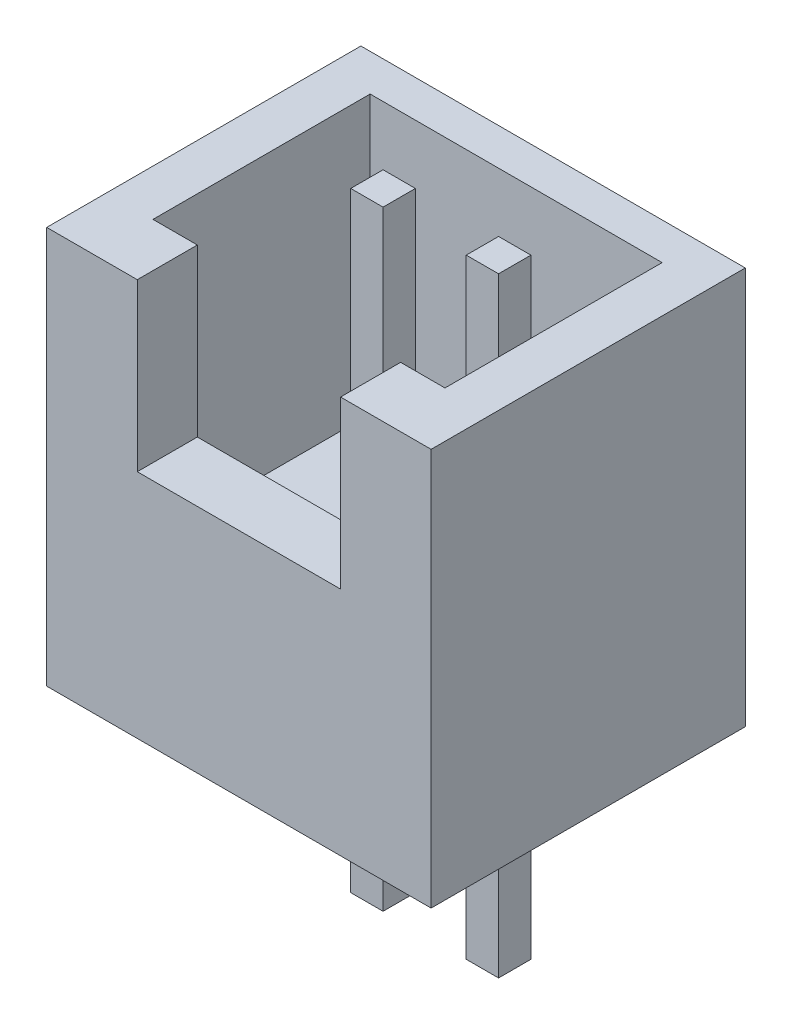
ISO-10303-21;
HEADER;
FILE_DESCRIPTION(('STEP AP214'),'2;1');
FILE_NAME('part.step','',(''),(''),'','','');
FILE_SCHEMA(('AUTOMOTIVE_DESIGN { 1 0 10303 214 1 1 1 1 }'));
ENDSEC;
DATA;
#1=APPLICATION_CONTEXT('core data for automotive mechanical design processes');
#2=APPLICATION_PROTOCOL_DEFINITION('international standard','automotive_design',2000,#1);
#3=PRODUCT_CONTEXT('',#1,'mechanical');
#4=PRODUCT('Part','Part','',(#3));
#5=PRODUCT_RELATED_PRODUCT_CATEGORY('part','',(#4));
#6=PRODUCT_DEFINITION_FORMATION('','',#4);
#7=PRODUCT_DEFINITION_CONTEXT('part definition',#1,'design');
#8=PRODUCT_DEFINITION('design','',#6,#7);
#9=PRODUCT_DEFINITION_SHAPE('','',#8);
#10=(LENGTH_UNIT() NAMED_UNIT(*) SI_UNIT(.MILLI.,.METRE.));
#11=(NAMED_UNIT(*) PLANE_ANGLE_UNIT() SI_UNIT($,.RADIAN.));
#12=(NAMED_UNIT(*) SI_UNIT($,.STERADIAN.) SOLID_ANGLE_UNIT());
#13=UNCERTAINTY_MEASURE_WITH_UNIT(LENGTH_MEASURE(1.E-05),#10,'distance_accuracy_value','');
#14=(GEOMETRIC_REPRESENTATION_CONTEXT(3) GLOBAL_UNCERTAINTY_ASSIGNED_CONTEXT((#13)) GLOBAL_UNIT_ASSIGNED_CONTEXT((#10,
#11,#12)) REPRESENTATION_CONTEXT('',''));
#15=CARTESIAN_POINT('',(0.,0.,0.));
#16=DIRECTION('',(0.,0.,1.));
#17=DIRECTION('',(1.,0.,0.));
#18=AXIS2_PLACEMENT_3D('',#15,#16,#17);
#19=CARTESIAN_POINT('',(-0.175000000000002,-2.3,-0.174999999999998));
#20=DIRECTION('',(0.,0.,-1.));
#21=DIRECTION('',(-1.,0.,0.));
#22=AXIS2_PLACEMENT_3D('',#19,#20,#21);
#23=PLANE('',#22);
#24=DIRECTION('',(0.,1.,0.));
#25=VECTOR('',#24,1.);
#26=CARTESIAN_POINT('',(-0.175000000000002,-2.3,-0.174999999999998));
#27=LINE('',#26,#25);
#28=CARTESIAN_POINT('',(-0.175000000000002,4.3,-0.174999999999998));
#29=VERTEX_POINT('',#28);
#30=CARTESIAN_POINT('',(-0.175000000000002,1.3,-0.174999999999998));
#31=VERTEX_POINT('',#30);
#32=EDGE_CURVE('E204',#29,#31,#27,.F.);
#33=ORIENTED_EDGE('',*,*,#32,.F.);
#34=DIRECTION('',(-1.,0.,0.));
#35=VECTOR('',#34,1.);
#36=CARTESIAN_POINT('',(-0.175000000000002,4.3,-0.174999999999998));
#37=LINE('',#36,#35);
#38=CARTESIAN_POINT('',(0.175000000000002,4.3,-0.174999999999998));
#39=VERTEX_POINT('',#38);
#40=EDGE_CURVE('E209',#29,#39,#37,.F.);
#41=ORIENTED_EDGE('',*,*,#40,.T.);
#42=DIRECTION('',(0.,1.,0.));
#43=VECTOR('',#42,1.);
#44=CARTESIAN_POINT('',(0.175000000000002,-2.3,-0.174999999999998));
#45=LINE('',#44,#43);
#46=CARTESIAN_POINT('',(0.175000000000002,1.3,-0.174999999999998));
#47=VERTEX_POINT('',#46);
#48=EDGE_CURVE('E206',#47,#39,#45,.T.);
#49=ORIENTED_EDGE('',*,*,#48,.F.);
#50=DIRECTION('',(-1.,0.,0.));
#51=VECTOR('',#50,1.);
#52=CARTESIAN_POINT('',(-0.175000000000002,1.3,-0.174999999999998));
#53=LINE('',#52,#51);
#54=EDGE_CURVE('E19',#47,#31,#53,.T.);
#55=ORIENTED_EDGE('',*,*,#54,.T.);
#56=EDGE_LOOP('',(#33,#41,#49,#55));
#57=FACE_BOUND('',#56,.T.);
#58=ADVANCED_FACE('F16',(#57),#23,.T.);
#59=CARTESIAN_POINT('',(-1.425,-2.3,-0.174999999999998));
#60=DIRECTION('',(0.,0.,-1.));
#61=DIRECTION('',(-1.,0.,0.));
#62=AXIS2_PLACEMENT_3D('',#59,#60,#61);
#63=PLANE('',#62);
#64=DIRECTION('',(0.,1.,0.));
#65=VECTOR('',#64,1.);
#66=CARTESIAN_POINT('',(-1.425,-2.3,-0.174999999999998));
#67=LINE('',#66,#65);
#68=CARTESIAN_POINT('',(-1.425,4.3,-0.174999999999998));
#69=VERTEX_POINT('',#68);
#70=CARTESIAN_POINT('',(-1.425,1.3,-0.174999999999998));
#71=VERTEX_POINT('',#70);
#72=EDGE_CURVE('E237',#69,#71,#67,.F.);
#73=ORIENTED_EDGE('',*,*,#72,.F.);
#74=DIRECTION('',(-1.,0.,0.));
#75=VECTOR('',#74,1.);
#76=CARTESIAN_POINT('',(-1.425,4.3,-0.174999999999998));
#77=LINE('',#76,#75);
#78=CARTESIAN_POINT('',(-1.075,4.3,-0.174999999999998));
#79=VERTEX_POINT('',#78);
#80=EDGE_CURVE('E216',#69,#79,#77,.F.);
#81=ORIENTED_EDGE('',*,*,#80,.T.);
#82=DIRECTION('',(0.,1.,0.));
#83=VECTOR('',#82,1.);
#84=CARTESIAN_POINT('',(-1.075,-2.3,-0.174999999999998));
#85=LINE('',#84,#83);
#86=CARTESIAN_POINT('',(-1.075,1.3,-0.174999999999998));
#87=VERTEX_POINT('',#86);
#88=EDGE_CURVE('E247',#87,#79,#85,.T.);
#89=ORIENTED_EDGE('',*,*,#88,.F.);
#90=DIRECTION('',(-1.,0.,0.));
#91=VECTOR('',#90,1.);
#92=CARTESIAN_POINT('',(-1.425,1.3,-0.174999999999998));
#93=LINE('',#92,#91);
#94=EDGE_CURVE('E227',#87,#71,#93,.T.);
#95=ORIENTED_EDGE('',*,*,#94,.T.);
#96=EDGE_LOOP('',(#73,#81,#89,#95));
#97=FACE_BOUND('',#96,.T.);
#98=ADVANCED_FACE('F803',(#97),#63,.T.);
#99=CARTESIAN_POINT('',(-0.175000000000002,-2.3,-0.174999999999998));
#100=DIRECTION('',(-1.,0.,0.));
#101=DIRECTION('',(0.,0.,1.));
#102=AXIS2_PLACEMENT_3D('',#99,#100,#101);
#103=PLANE('',#102);
#104=DIRECTION('',(0.,1.,0.));
#105=VECTOR('',#104,1.);
#106=CARTESIAN_POINT('',(-0.175000000000002,-2.3,0.175000000000002));
#107=LINE('',#106,#105);
#108=CARTESIAN_POINT('',(-0.175000000000002,4.3,0.175000000000002));
#109=VERTEX_POINT('',#108);
#110=CARTESIAN_POINT('',(-0.175000000000002,1.3,0.175000000000002));
#111=VERTEX_POINT('',#110);
#112=EDGE_CURVE('E255',#109,#111,#107,.F.);
#113=ORIENTED_EDGE('',*,*,#112,.F.);
#114=DIRECTION('',(0.,0.,1.));
#115=VECTOR('',#114,1.);
#116=CARTESIAN_POINT('',(-0.175000000000002,4.3,2.185));
#117=LINE('',#116,#115);
#118=EDGE_CURVE('E215',#29,#109,#117,.T.);
#119=ORIENTED_EDGE('',*,*,#118,.F.);
#120=ORIENTED_EDGE('',*,*,#32,.T.);
#121=DIRECTION('',(0.,0.,1.));
#122=VECTOR('',#121,1.);
#123=CARTESIAN_POINT('',(-0.175000000000002,1.3,-0.174999999999998));
#124=LINE('',#123,#122);
#125=EDGE_CURVE('E213',#31,#111,#124,.T.);
#126=ORIENTED_EDGE('',*,*,#125,.T.);
#127=EDGE_LOOP('',(#113,#119,#120,#126));
#128=FACE_BOUND('',#127,.T.);
#129=ADVANCED_FACE('F212',(#128),#103,.T.);
#130=CARTESIAN_POINT('',(0.175000000000002,-2.3,-0.174999999999998));
#131=DIRECTION('',(1.,0.,0.));
#132=DIRECTION('',(0.,0.,-1.));
#133=AXIS2_PLACEMENT_3D('',#130,#131,#132);
#134=PLANE('',#133);
#135=ORIENTED_EDGE('',*,*,#48,.T.);
#136=DIRECTION('',(0.,0.,1.));
#137=VECTOR('',#136,1.);
#138=CARTESIAN_POINT('',(0.175000000000002,4.3,2.185));
#139=LINE('',#138,#137);
#140=CARTESIAN_POINT('',(0.175000000000002,4.3,0.175000000000002));
#141=VERTEX_POINT('',#140);
#142=EDGE_CURVE('E232',#141,#39,#139,.F.);
#143=ORIENTED_EDGE('',*,*,#142,.F.);
#144=DIRECTION('',(0.,1.,0.));
#145=VECTOR('',#144,1.);
#146=CARTESIAN_POINT('',(0.175000000000002,-2.3,0.175000000000002));
#147=LINE('',#146,#145);
#148=CARTESIAN_POINT('',(0.175000000000002,1.3,0.175000000000002));
#149=VERTEX_POINT('',#148);
#150=EDGE_CURVE('E257',#149,#141,#147,.T.);
#151=ORIENTED_EDGE('',*,*,#150,.F.);
#152=DIRECTION('',(0.,0.,-1.));
#153=VECTOR('',#152,1.);
#154=CARTESIAN_POINT('',(0.175000000000002,1.3,-0.174999999999998));
#155=LINE('',#154,#153);
#156=EDGE_CURVE('E197',#149,#47,#155,.T.);
#157=ORIENTED_EDGE('',*,*,#156,.T.);
#158=EDGE_LOOP('',(#135,#143,#151,#157));
#159=FACE_BOUND('',#158,.T.);
#160=ADVANCED_FACE('F231',(#159),#134,.T.);
#161=CARTESIAN_POINT('',(-2.70500000000001,4.3,2.185));
#162=DIRECTION('',(0.,1.,0.));
#163=DIRECTION('',(0.,0.,1.));
#164=AXIS2_PLACEMENT_3D('',#161,#162,#163);
#165=PLANE('',#164);
#166=DIRECTION('',(1.,0.,0.));
#167=VECTOR('',#166,1.);
#168=CARTESIAN_POINT('',(-0.175000000000002,4.3,0.175000000000002));
#169=LINE('',#168,#167);
#170=EDGE_CURVE('E236',#141,#109,#169,.F.);
#171=ORIENTED_EDGE('',*,*,#170,.F.);
#172=ORIENTED_EDGE('',*,*,#142,.T.);
#173=ORIENTED_EDGE('',*,*,#40,.F.);
#174=ORIENTED_EDGE('',*,*,#118,.T.);
#175=EDGE_LOOP('',(#171,#172,#173,#174));
#176=FACE_BOUND('',#175,.T.);
#177=ADVANCED_FACE('F234',(#176),#165,.T.);
#178=CARTESIAN_POINT('',(-1.425,-2.3,-0.174999999999998));
#179=DIRECTION('',(-1.,0.,0.));
#180=DIRECTION('',(0.,0.,1.));
#181=AXIS2_PLACEMENT_3D('',#178,#179,#180);
#182=PLANE('',#181);
#183=DIRECTION('',(0.,1.,0.));
#184=VECTOR('',#183,1.);
#185=CARTESIAN_POINT('',(-1.425,-2.3,0.175000000000002));
#186=LINE('',#185,#184);
#187=CARTESIAN_POINT('',(-1.425,4.3,0.175000000000002));
#188=VERTEX_POINT('',#187);
#189=CARTESIAN_POINT('',(-1.425,1.3,0.175000000000002));
#190=VERTEX_POINT('',#189);
#191=EDGE_CURVE('E260',#188,#190,#186,.F.);
#192=ORIENTED_EDGE('',*,*,#191,.F.);
#193=DIRECTION('',(0.,0.,1.));
#194=VECTOR('',#193,1.);
#195=CARTESIAN_POINT('',(-1.425,4.3,2.185));
#196=LINE('',#195,#194);
#197=EDGE_CURVE('E250',#69,#188,#196,.T.);
#198=ORIENTED_EDGE('',*,*,#197,.F.);
#199=ORIENTED_EDGE('',*,*,#72,.T.);
#200=DIRECTION('',(0.,0.,1.));
#201=VECTOR('',#200,1.);
#202=CARTESIAN_POINT('',(-1.425,1.3,-0.174999999999998));
#203=LINE('',#202,#201);
#204=EDGE_CURVE('E240',#71,#190,#203,.T.);
#205=ORIENTED_EDGE('',*,*,#204,.T.);
#206=EDGE_LOOP('',(#192,#198,#199,#205));
#207=FACE_BOUND('',#206,.T.);
#208=ADVANCED_FACE('F768',(#207),#182,.T.);
#209=CARTESIAN_POINT('',(-1.075,-2.3,-0.174999999999998));
#210=DIRECTION('',(1.,0.,0.));
#211=DIRECTION('',(0.,0.,-1.));
#212=AXIS2_PLACEMENT_3D('',#209,#210,#211);
#213=PLANE('',#212);
#214=ORIENTED_EDGE('',*,*,#88,.T.);
#215=DIRECTION('',(0.,0.,1.));
#216=VECTOR('',#215,1.);
#217=CARTESIAN_POINT('',(-1.075,4.3,2.185));
#218=LINE('',#217,#216);
#219=CARTESIAN_POINT('',(-1.075,4.3,0.175000000000002));
#220=VERTEX_POINT('',#219);
#221=EDGE_CURVE('E252',#220,#79,#218,.F.);
#222=ORIENTED_EDGE('',*,*,#221,.F.);
#223=DIRECTION('',(0.,1.,0.));
#224=VECTOR('',#223,1.);
#225=CARTESIAN_POINT('',(-1.075,-2.3,0.175000000000002));
#226=LINE('',#225,#224);
#227=CARTESIAN_POINT('',(-1.075,1.3,0.175000000000002));
#228=VERTEX_POINT('',#227);
#229=EDGE_CURVE('E263',#228,#220,#226,.T.);
#230=ORIENTED_EDGE('',*,*,#229,.F.);
#231=DIRECTION('',(0.,0.,-1.));
#232=VECTOR('',#231,1.);
#233=CARTESIAN_POINT('',(-1.075,1.3,-0.174999999999998));
#234=LINE('',#233,#232);
#235=EDGE_CURVE('E245',#228,#87,#234,.T.);
#236=ORIENTED_EDGE('',*,*,#235,.T.);
#237=EDGE_LOOP('',(#214,#222,#230,#236));
#238=FACE_BOUND('',#237,.T.);
#239=ADVANCED_FACE('F758',(#238),#213,.T.);
#240=CARTESIAN_POINT('',(-2.70500000000001,4.3,2.185));
#241=DIRECTION('',(0.,1.,0.));
#242=DIRECTION('',(0.,0.,1.));
#243=AXIS2_PLACEMENT_3D('',#240,#241,#242);
#244=PLANE('',#243);
#245=DIRECTION('',(1.,0.,0.));
#246=VECTOR('',#245,1.);
#247=CARTESIAN_POINT('',(-1.425,4.3,0.175000000000002));
#248=LINE('',#247,#246);
#249=EDGE_CURVE('E265',#220,#188,#248,.F.);
#250=ORIENTED_EDGE('',*,*,#249,.F.);
#251=ORIENTED_EDGE('',*,*,#221,.T.);
#252=ORIENTED_EDGE('',*,*,#80,.F.);
#253=ORIENTED_EDGE('',*,*,#197,.T.);
#254=EDGE_LOOP('',(#250,#251,#252,#253));
#255=FACE_BOUND('',#254,.T.);
#256=ADVANCED_FACE('F748',(#255),#244,.T.);
#257=CARTESIAN_POINT('',(-0.175000000000002,-2.3,0.175000000000002));
#258=DIRECTION('',(0.,0.,1.));
#259=DIRECTION('',(1.,0.,0.));
#260=AXIS2_PLACEMENT_3D('',#257,#258,#259);
#261=PLANE('',#260);
#262=ORIENTED_EDGE('',*,*,#150,.T.);
#263=ORIENTED_EDGE('',*,*,#170,.T.);
#264=ORIENTED_EDGE('',*,*,#112,.T.);
#265=DIRECTION('',(1.,0.,0.));
#266=VECTOR('',#265,1.);
#267=CARTESIAN_POINT('',(-2.20500000000001,1.3,0.175000000000002));
#268=LINE('',#267,#266);
#269=EDGE_CURVE('E221',#149,#111,#268,.F.);
#270=ORIENTED_EDGE('',*,*,#269,.F.);
#271=EDGE_LOOP('',(#262,#263,#264,#270));
#272=FACE_BOUND('',#271,.T.);
#273=ADVANCED_FACE('F738',(#272),#261,.T.);
#274=CARTESIAN_POINT('',(-1.425,-2.3,0.175000000000002));
#275=DIRECTION('',(0.,0.,1.));
#276=DIRECTION('',(1.,0.,0.));
#277=AXIS2_PLACEMENT_3D('',#274,#275,#276);
#278=PLANE('',#277);
#279=ORIENTED_EDGE('',*,*,#229,.T.);
#280=ORIENTED_EDGE('',*,*,#249,.T.);
#281=ORIENTED_EDGE('',*,*,#191,.T.);
#282=DIRECTION('',(1.,0.,0.));
#283=VECTOR('',#282,1.);
#284=CARTESIAN_POINT('',(-2.20500000000001,1.3,0.175000000000002));
#285=LINE('',#284,#283);
#286=EDGE_CURVE('E277',#228,#190,#285,.F.);
#287=ORIENTED_EDGE('',*,*,#286,.F.);
#288=EDGE_LOOP('',(#279,#280,#281,#287));
#289=FACE_BOUND('',#288,.T.);
#290=ADVANCED_FACE('F729',(#289),#278,.T.);
#291=CARTESIAN_POINT('',(-0.175000000000002,-2.3,0.175000000000002));
#292=DIRECTION('',(0.,0.,1.));
#293=DIRECTION('',(1.,0.,0.));
#294=AXIS2_PLACEMENT_3D('',#291,#292,#293);
#295=PLANE('',#294);
#296=DIRECTION('',(1.,0.,0.));
#297=VECTOR('',#296,1.);
#298=CARTESIAN_POINT('',(-0.175000000000002,-2.3,0.175000000000002));
#299=LINE('',#298,#297);
#300=CARTESIAN_POINT('',(-0.175000000000002,-2.3,0.175000000000002));
#301=VERTEX_POINT('',#300);
#302=CARTESIAN_POINT('',(0.175000000000002,-2.3,0.175000000000002));
#303=VERTEX_POINT('',#302);
#304=EDGE_CURVE('E286',#301,#303,#299,.T.);
#305=ORIENTED_EDGE('',*,*,#304,.T.);
#306=DIRECTION('',(0.,1.,0.));
#307=VECTOR('',#306,1.);
#308=CARTESIAN_POINT('',(0.175000000000002,-2.3,0.175000000000002));
#309=LINE('',#308,#307);
#310=CARTESIAN_POINT('',(0.175000000000002,0.,0.175000000000002));
#311=VERTEX_POINT('',#310);
#312=EDGE_CURVE('E284',#311,#303,#309,.F.);
#313=ORIENTED_EDGE('',*,*,#312,.F.);
#314=DIRECTION('',(1.,0.,0.));
#315=VECTOR('',#314,1.);
#316=CARTESIAN_POINT('',(-0.175000000000002,0.,0.175000000000002));
#317=LINE('',#316,#315);
#318=CARTESIAN_POINT('',(-0.175000000000002,0.,0.175000000000002));
#319=VERTEX_POINT('',#318);
#320=EDGE_CURVE('E268',#311,#319,#317,.F.);
#321=ORIENTED_EDGE('',*,*,#320,.T.);
#322=DIRECTION('',(0.,1.,0.));
#323=VECTOR('',#322,1.);
#324=CARTESIAN_POINT('',(-0.175000000000002,-2.3,0.175000000000002));
#325=LINE('',#324,#323);
#326=EDGE_CURVE('E297',#301,#319,#325,.T.);
#327=ORIENTED_EDGE('',*,*,#326,.F.);
#328=EDGE_LOOP('',(#305,#313,#321,#327));
#329=FACE_BOUND('',#328,.T.);
#330=ADVANCED_FACE('F462',(#329),#295,.T.);
#331=CARTESIAN_POINT('',(-1.425,-2.3,0.175000000000002));
#332=DIRECTION('',(0.,0.,1.));
#333=DIRECTION('',(1.,0.,0.));
#334=AXIS2_PLACEMENT_3D('',#331,#332,#333);
#335=PLANE('',#334);
#336=DIRECTION('',(1.,0.,0.));
#337=VECTOR('',#336,1.);
#338=CARTESIAN_POINT('',(-1.425,-2.3,0.175000000000002));
#339=LINE('',#338,#337);
#340=CARTESIAN_POINT('',(-1.425,-2.3,0.175000000000002));
#341=VERTEX_POINT('',#340);
#342=CARTESIAN_POINT('',(-1.075,-2.3,0.175000000000002));
#343=VERTEX_POINT('',#342);
#344=EDGE_CURVE('E304',#341,#343,#339,.T.);
#345=ORIENTED_EDGE('',*,*,#344,.T.);
#346=DIRECTION('',(0.,1.,0.));
#347=VECTOR('',#346,1.);
#348=CARTESIAN_POINT('',(-1.075,-2.3,0.175000000000002));
#349=LINE('',#348,#347);
#350=CARTESIAN_POINT('',(-1.075,0.,0.175000000000002));
#351=VERTEX_POINT('',#350);
#352=EDGE_CURVE('E302',#351,#343,#349,.F.);
#353=ORIENTED_EDGE('',*,*,#352,.F.);
#354=DIRECTION('',(1.,0.,0.));
#355=VECTOR('',#354,1.);
#356=CARTESIAN_POINT('',(-1.425,0.,0.175000000000002));
#357=LINE('',#356,#355);
#358=CARTESIAN_POINT('',(-1.425,0.,0.175000000000002));
#359=VERTEX_POINT('',#358);
#360=EDGE_CURVE('E270',#351,#359,#357,.F.);
#361=ORIENTED_EDGE('',*,*,#360,.T.);
#362=DIRECTION('',(0.,1.,0.));
#363=VECTOR('',#362,1.);
#364=CARTESIAN_POINT('',(-1.425,-2.3,0.175000000000002));
#365=LINE('',#364,#363);
#366=EDGE_CURVE('E315',#341,#359,#365,.T.);
#367=ORIENTED_EDGE('',*,*,#366,.F.);
#368=EDGE_LOOP('',(#345,#353,#361,#367));
#369=FACE_BOUND('',#368,.T.);
#370=ADVANCED_FACE('F710',(#369),#335,.T.);
#371=CARTESIAN_POINT('',(-2.20500000000001,1.3,1.535));
#372=DIRECTION('',(0.,0.,1.));
#373=DIRECTION('',(1.,0.,0.));
#374=AXIS2_PLACEMENT_3D('',#371,#372,#373);
#375=PLANE('',#374);
#376=DIRECTION('',(0.,1.,0.));
#377=VECTOR('',#376,1.);
#378=CARTESIAN_POINT('',(-1.725,2.5,1.535));
#379=LINE('',#378,#377);
#380=CARTESIAN_POINT('',(-1.725,4.3,1.535));
#381=VERTEX_POINT('',#380);
#382=CARTESIAN_POINT('',(-1.725,2.5,1.535));
#383=VERTEX_POINT('',#382);
#384=EDGE_CURVE('E323',#381,#383,#379,.F.);
#385=ORIENTED_EDGE('',*,*,#384,.T.);
#386=DIRECTION('',(1.,0.,0.));
#387=VECTOR('',#386,1.);
#388=CARTESIAN_POINT('',(-1.725,2.5,1.535));
#389=LINE('',#388,#387);
#390=CARTESIAN_POINT('',(0.474999999999989,2.5,1.535));
#391=VERTEX_POINT('',#390);
#392=EDGE_CURVE('E333',#391,#383,#389,.F.);
#393=ORIENTED_EDGE('',*,*,#392,.F.);
#394=DIRECTION('',(0.,1.,0.));
#395=VECTOR('',#394,1.);
#396=CARTESIAN_POINT('',(0.474999999999989,2.5,1.535));
#397=LINE('',#396,#395);
#398=CARTESIAN_POINT('',(0.474999999999989,4.3,1.535));
#399=VERTEX_POINT('',#398);
#400=EDGE_CURVE('E318',#391,#399,#397,.T.);
#401=ORIENTED_EDGE('',*,*,#400,.T.);
#402=DIRECTION('',(1.,0.,0.));
#403=VECTOR('',#402,1.);
#404=CARTESIAN_POINT('',(-2.20500000000001,4.3,1.535));
#405=LINE('',#404,#403);
#406=CARTESIAN_POINT('',(0.954999999999991,4.3,1.535));
#407=VERTEX_POINT('',#406);
#408=EDGE_CURVE('E272',#407,#399,#405,.F.);
#409=ORIENTED_EDGE('',*,*,#408,.F.);
#410=DIRECTION('',(0.,1.,0.));
#411=VECTOR('',#410,1.);
#412=CARTESIAN_POINT('',(0.954999999999991,1.3,1.535));
#413=LINE('',#412,#411);
#414=CARTESIAN_POINT('',(0.954999999999991,1.3,1.535));
#415=VERTEX_POINT('',#414);
#416=EDGE_CURVE('E348',#407,#415,#413,.F.);
#417=ORIENTED_EDGE('',*,*,#416,.T.);
#418=DIRECTION('',(1.,0.,0.));
#419=VECTOR('',#418,1.);
#420=CARTESIAN_POINT('',(-2.20500000000001,1.3,1.535));
#421=LINE('',#420,#419);
#422=CARTESIAN_POINT('',(-2.20500000000001,1.3,1.535));
#423=VERTEX_POINT('',#422);
#424=EDGE_CURVE('E280',#423,#415,#421,.T.);
#425=ORIENTED_EDGE('',*,*,#424,.F.);
#426=DIRECTION('',(0.,1.,0.));
#427=VECTOR('',#426,1.);
#428=CARTESIAN_POINT('',(-2.20500000000001,1.3,1.535));
#429=LINE('',#428,#427);
#430=CARTESIAN_POINT('',(-2.20500000000001,4.3,1.535));
#431=VERTEX_POINT('',#430);
#432=EDGE_CURVE('E339',#423,#431,#429,.T.);
#433=ORIENTED_EDGE('',*,*,#432,.T.);
#434=DIRECTION('',(1.,0.,0.));
#435=VECTOR('',#434,1.);
#436=CARTESIAN_POINT('',(-2.20500000000001,4.3,1.535));
#437=LINE('',#436,#435);
#438=EDGE_CURVE('E274',#381,#431,#437,.F.);
#439=ORIENTED_EDGE('',*,*,#438,.F.);
#440=EDGE_LOOP('',(#385,#393,#401,#409,#417,#425,#433,#439));
#441=FACE_BOUND('',#440,.T.);
#442=ADVANCED_FACE('F473',(#441),#375,.F.);
#443=CARTESIAN_POINT('',(-2.20500000000001,1.3,1.535));
#444=DIRECTION('',(0.,1.,0.));
#445=DIRECTION('',(0.,0.,1.));
#446=AXIS2_PLACEMENT_3D('',#443,#444,#445);
#447=PLANE('',#446);
#448=DIRECTION('',(0.,0.,-1.));
#449=VECTOR('',#448,1.);
#450=CARTESIAN_POINT('',(0.954999999999991,1.3,-0.815));
#451=LINE('',#450,#449);
#452=CARTESIAN_POINT('',(0.954999999999991,1.3,-0.815));
#453=VERTEX_POINT('',#452);
#454=EDGE_CURVE('E351',#415,#453,#451,.T.);
#455=ORIENTED_EDGE('',*,*,#454,.T.);
#456=DIRECTION('',(-1.,0.,0.));
#457=VECTOR('',#456,1.);
#458=CARTESIAN_POINT('',(-2.20500000000001,1.3,-0.815));
#459=LINE('',#458,#457);
#460=CARTESIAN_POINT('',(-2.20500000000001,1.3,-0.815));
#461=VERTEX_POINT('',#460);
#462=EDGE_CURVE('E342',#453,#461,#459,.T.);
#463=ORIENTED_EDGE('',*,*,#462,.T.);
#464=DIRECTION('',(0.,0.,1.));
#465=VECTOR('',#464,1.);
#466=CARTESIAN_POINT('',(-2.20500000000001,1.3,-0.815));
#467=LINE('',#466,#465);
#468=EDGE_CURVE('E336',#461,#423,#467,.T.);
#469=ORIENTED_EDGE('',*,*,#468,.T.);
#470=ORIENTED_EDGE('',*,*,#424,.T.);
#471=EDGE_LOOP('',(#455,#463,#469,#470));
#472=FACE_BOUND('',#471,.T.);
#473=ORIENTED_EDGE('',*,*,#235,.F.);
#474=ORIENTED_EDGE('',*,*,#286,.T.);
#475=ORIENTED_EDGE('',*,*,#204,.F.);
#476=ORIENTED_EDGE('',*,*,#94,.F.);
#477=EDGE_LOOP('',(#473,#474,#475,#476));
#478=FACE_BOUND('',#477,.T.);
#479=ORIENTED_EDGE('',*,*,#156,.F.);
#480=ORIENTED_EDGE('',*,*,#269,.T.);
#481=ORIENTED_EDGE('',*,*,#125,.F.);
#482=ORIENTED_EDGE('',*,*,#54,.F.);
#483=EDGE_LOOP('',(#479,#480,#481,#482));
#484=FACE_BOUND('',#483,.T.);
#485=ADVANCED_FACE('F219',(#472,#478,#484),#447,.T.);
#486=CARTESIAN_POINT('',(0.175000000000002,-2.3,-0.174999999999998));
#487=DIRECTION('',(1.,0.,0.));
#488=DIRECTION('',(0.,0.,-1.));
#489=AXIS2_PLACEMENT_3D('',#486,#487,#488);
#490=PLANE('',#489);
#491=DIRECTION('',(0.,0.,1.));
#492=VECTOR('',#491,1.);
#493=CARTESIAN_POINT('',(0.175000000000002,-2.3,0.175000000000002));
#494=LINE('',#493,#492);
#495=CARTESIAN_POINT('',(0.175000000000002,-2.3,-0.174999999999998));
#496=VERTEX_POINT('',#495);
#497=EDGE_CURVE('E289',#303,#496,#494,.F.);
#498=ORIENTED_EDGE('',*,*,#497,.T.);
#499=DIRECTION('',(0.,1.,0.));
#500=VECTOR('',#499,1.);
#501=CARTESIAN_POINT('',(0.175000000000002,-2.3,-0.174999999999998));
#502=LINE('',#501,#500);
#503=CARTESIAN_POINT('',(0.175000000000002,0.,-0.174999999999998));
#504=VERTEX_POINT('',#503);
#505=EDGE_CURVE('E357',#504,#496,#502,.F.);
#506=ORIENTED_EDGE('',*,*,#505,.F.);
#507=DIRECTION('',(0.,0.,-1.));
#508=VECTOR('',#507,1.);
#509=CARTESIAN_POINT('',(0.175000000000002,0.,-0.174999999999998));
#510=LINE('',#509,#508);
#511=EDGE_CURVE('E282',#504,#311,#510,.F.);
#512=ORIENTED_EDGE('',*,*,#511,.T.);
#513=ORIENTED_EDGE('',*,*,#312,.T.);
#514=EDGE_LOOP('',(#498,#506,#512,#513));
#515=FACE_BOUND('',#514,.T.);
#516=ADVANCED_FACE('F464',(#515),#490,.T.);
#517=CARTESIAN_POINT('',(-0.175000000000002,-2.3,0.175000000000002));
#518=DIRECTION('',(0.,1.,0.));
#519=DIRECTION('',(0.,0.,1.));
#520=AXIS2_PLACEMENT_3D('',#517,#518,#519);
#521=PLANE('',#520);
#522=DIRECTION('',(-1.,0.,0.));
#523=VECTOR('',#522,1.);
#524=CARTESIAN_POINT('',(-0.175000000000002,-2.3,-0.174999999999998));
#525=LINE('',#524,#523);
#526=CARTESIAN_POINT('',(-0.175000000000002,-2.3,-0.174999999999998));
#527=VERTEX_POINT('',#526);
#528=EDGE_CURVE('E359',#496,#527,#525,.T.);
#529=ORIENTED_EDGE('',*,*,#528,.F.);
#530=ORIENTED_EDGE('',*,*,#497,.F.);
#531=ORIENTED_EDGE('',*,*,#304,.F.);
#532=DIRECTION('',(0.,0.,1.));
#533=VECTOR('',#532,1.);
#534=CARTESIAN_POINT('',(-0.175000000000002,-2.3,-0.174999999999998));
#535=LINE('',#534,#533);
#536=EDGE_CURVE('E294',#527,#301,#535,.T.);
#537=ORIENTED_EDGE('',*,*,#536,.F.);
#538=EDGE_LOOP('',(#529,#530,#531,#537));
#539=FACE_BOUND('',#538,.T.);
#540=ADVANCED_FACE('F460',(#539),#521,.F.);
#541=CARTESIAN_POINT('',(-0.175000000000002,-2.3,-0.174999999999998));
#542=DIRECTION('',(-1.,0.,0.));
#543=DIRECTION('',(0.,0.,1.));
#544=AXIS2_PLACEMENT_3D('',#541,#542,#543);
#545=PLANE('',#544);
#546=ORIENTED_EDGE('',*,*,#536,.T.);
#547=ORIENTED_EDGE('',*,*,#326,.T.);
#548=DIRECTION('',(0.,0.,1.));
#549=VECTOR('',#548,1.);
#550=CARTESIAN_POINT('',(-0.175000000000002,0.,-0.174999999999998));
#551=LINE('',#550,#549);
#552=CARTESIAN_POINT('',(-0.175000000000002,0.,-0.174999999999998));
#553=VERTEX_POINT('',#552);
#554=EDGE_CURVE('E292',#319,#553,#551,.F.);
#555=ORIENTED_EDGE('',*,*,#554,.T.);
#556=DIRECTION('',(0.,1.,0.));
#557=VECTOR('',#556,1.);
#558=CARTESIAN_POINT('',(-0.175000000000002,-2.3,-0.174999999999998));
#559=LINE('',#558,#557);
#560=EDGE_CURVE('E361',#527,#553,#559,.T.);
#561=ORIENTED_EDGE('',*,*,#560,.F.);
#562=EDGE_LOOP('',(#546,#547,#555,#561));
#563=FACE_BOUND('',#562,.T.);
#564=ADVANCED_FACE('F451',(#563),#545,.T.);
#565=CARTESIAN_POINT('',(-1.075,-2.3,-0.174999999999998));
#566=DIRECTION('',(1.,0.,0.));
#567=DIRECTION('',(0.,0.,-1.));
#568=AXIS2_PLACEMENT_3D('',#565,#566,#567);
#569=PLANE('',#568);
#570=DIRECTION('',(0.,0.,1.));
#571=VECTOR('',#570,1.);
#572=CARTESIAN_POINT('',(-1.075,-2.3,0.175000000000002));
#573=LINE('',#572,#571);
#574=CARTESIAN_POINT('',(-1.075,-2.3,-0.174999999999998));
#575=VERTEX_POINT('',#574);
#576=EDGE_CURVE('E307',#343,#575,#573,.F.);
#577=ORIENTED_EDGE('',*,*,#576,.T.);
#578=DIRECTION('',(0.,1.,0.));
#579=VECTOR('',#578,1.);
#580=CARTESIAN_POINT('',(-1.075,-2.3,-0.174999999999998));
#581=LINE('',#580,#579);
#582=CARTESIAN_POINT('',(-1.075,0.,-0.174999999999998));
#583=VERTEX_POINT('',#582);
#584=EDGE_CURVE('E364',#583,#575,#581,.F.);
#585=ORIENTED_EDGE('',*,*,#584,.F.);
#586=DIRECTION('',(0.,0.,-1.));
#587=VECTOR('',#586,1.);
#588=CARTESIAN_POINT('',(-1.075,0.,-0.174999999999998));
#589=LINE('',#588,#587);
#590=EDGE_CURVE('E300',#583,#351,#589,.F.);
#591=ORIENTED_EDGE('',*,*,#590,.T.);
#592=ORIENTED_EDGE('',*,*,#352,.T.);
#593=EDGE_LOOP('',(#577,#585,#591,#592));
#594=FACE_BOUND('',#593,.T.);
#595=ADVANCED_FACE('F528',(#594),#569,.T.);
#596=CARTESIAN_POINT('',(-1.425,-2.3,0.175000000000002));
#597=DIRECTION('',(0.,1.,0.));
#598=DIRECTION('',(0.,0.,1.));
#599=AXIS2_PLACEMENT_3D('',#596,#597,#598);
#600=PLANE('',#599);
#601=DIRECTION('',(-1.,0.,0.));
#602=VECTOR('',#601,1.);
#603=CARTESIAN_POINT('',(-1.425,-2.3,-0.174999999999998));
#604=LINE('',#603,#602);
#605=CARTESIAN_POINT('',(-1.425,-2.3,-0.174999999999998));
#606=VERTEX_POINT('',#605);
#607=EDGE_CURVE('E366',#575,#606,#604,.T.);
#608=ORIENTED_EDGE('',*,*,#607,.F.);
#609=ORIENTED_EDGE('',*,*,#576,.F.);
#610=ORIENTED_EDGE('',*,*,#344,.F.);
#611=DIRECTION('',(0.,0.,1.));
#612=VECTOR('',#611,1.);
#613=CARTESIAN_POINT('',(-1.425,-2.3,-0.174999999999998));
#614=LINE('',#613,#612);
#615=EDGE_CURVE('E312',#606,#341,#614,.T.);
#616=ORIENTED_EDGE('',*,*,#615,.F.);
#617=EDGE_LOOP('',(#608,#609,#610,#616));
#618=FACE_BOUND('',#617,.T.);
#619=ADVANCED_FACE('F524',(#618),#600,.F.);
#620=CARTESIAN_POINT('',(-1.425,-2.3,-0.174999999999998));
#621=DIRECTION('',(-1.,0.,0.));
#622=DIRECTION('',(0.,0.,1.));
#623=AXIS2_PLACEMENT_3D('',#620,#621,#622);
#624=PLANE('',#623);
#625=ORIENTED_EDGE('',*,*,#615,.T.);
#626=ORIENTED_EDGE('',*,*,#366,.T.);
#627=DIRECTION('',(0.,0.,1.));
#628=VECTOR('',#627,1.);
#629=CARTESIAN_POINT('',(-1.425,0.,-0.174999999999998));
#630=LINE('',#629,#628);
#631=CARTESIAN_POINT('',(-1.425,0.,-0.174999999999998));
#632=VERTEX_POINT('',#631);
#633=EDGE_CURVE('E310',#359,#632,#630,.F.);
#634=ORIENTED_EDGE('',*,*,#633,.T.);
#635=DIRECTION('',(0.,1.,0.));
#636=VECTOR('',#635,1.);
#637=CARTESIAN_POINT('',(-1.425,-2.3,-0.174999999999998));
#638=LINE('',#637,#636);
#639=EDGE_CURVE('E368',#606,#632,#638,.T.);
#640=ORIENTED_EDGE('',*,*,#639,.F.);
#641=EDGE_LOOP('',(#625,#626,#634,#640));
#642=FACE_BOUND('',#641,.T.);
#643=ADVANCED_FACE('F520',(#642),#624,.T.);
#644=CARTESIAN_POINT('',(0.474999999999989,2.5,1.535));
#645=DIRECTION('',(1.,0.,0.));
#646=DIRECTION('',(0.,0.,-1.));
#647=AXIS2_PLACEMENT_3D('',#644,#645,#646);
#648=PLANE('',#647);
#649=ORIENTED_EDGE('',*,*,#400,.F.);
#650=DIRECTION('',(0.,0.,1.));
#651=VECTOR('',#650,1.);
#652=CARTESIAN_POINT('',(0.474999999999989,2.5,2.185));
#653=LINE('',#652,#651);
#654=CARTESIAN_POINT('',(0.474999999999989,2.5,2.185));
#655=VERTEX_POINT('',#654);
#656=EDGE_CURVE('E330',#655,#391,#653,.F.);
#657=ORIENTED_EDGE('',*,*,#656,.F.);
#658=DIRECTION('',(0.,1.,0.));
#659=VECTOR('',#658,1.);
#660=CARTESIAN_POINT('',(0.474999999999989,4.3,2.185));
#661=LINE('',#660,#659);
#662=CARTESIAN_POINT('',(0.474999999999989,4.3,2.185));
#663=VERTEX_POINT('',#662);
#664=EDGE_CURVE('E371',#655,#663,#661,.T.);
#665=ORIENTED_EDGE('',*,*,#664,.T.);
#666=DIRECTION('',(0.,0.,-1.));
#667=VECTOR('',#666,1.);
#668=CARTESIAN_POINT('',(0.474999999999989,4.3,1.535));
#669=LINE('',#668,#667);
#670=EDGE_CURVE('E321',#399,#663,#669,.F.);
#671=ORIENTED_EDGE('',*,*,#670,.F.);
#672=EDGE_LOOP('',(#649,#657,#665,#671));
#673=FACE_BOUND('',#672,.T.);
#674=ADVANCED_FACE('F516',(#673),#648,.F.);
#675=CARTESIAN_POINT('',(-1.725,2.5,1.535));
#676=DIRECTION('',(-1.,0.,0.));
#677=DIRECTION('',(0.,0.,1.));
#678=AXIS2_PLACEMENT_3D('',#675,#676,#677);
#679=PLANE('',#678);
#680=DIRECTION('',(0.,1.,0.));
#681=VECTOR('',#680,1.);
#682=CARTESIAN_POINT('',(-1.725,4.3,2.185));
#683=LINE('',#682,#681);
#684=CARTESIAN_POINT('',(-1.725,4.3,2.185));
#685=VERTEX_POINT('',#684);
#686=CARTESIAN_POINT('',(-1.725,2.5,2.185));
#687=VERTEX_POINT('',#686);
#688=EDGE_CURVE('E374',#685,#687,#683,.F.);
#689=ORIENTED_EDGE('',*,*,#688,.T.);
#690=DIRECTION('',(0.,0.,1.));
#691=VECTOR('',#690,1.);
#692=CARTESIAN_POINT('',(-1.725,2.5,2.185));
#693=LINE('',#692,#691);
#694=EDGE_CURVE('E328',#383,#687,#693,.T.);
#695=ORIENTED_EDGE('',*,*,#694,.F.);
#696=ORIENTED_EDGE('',*,*,#384,.F.);
#697=DIRECTION('',(0.,0.,1.));
#698=VECTOR('',#697,1.);
#699=CARTESIAN_POINT('',(-1.725,4.3,1.535));
#700=LINE('',#699,#698);
#701=EDGE_CURVE('E325',#685,#381,#700,.F.);
#702=ORIENTED_EDGE('',*,*,#701,.F.);
#703=EDGE_LOOP('',(#689,#695,#696,#702));
#704=FACE_BOUND('',#703,.T.);
#705=ADVANCED_FACE('F512',(#704),#679,.F.);
#706=CARTESIAN_POINT('',(-1.725,2.5,2.185));
#707=DIRECTION('',(0.,1.,0.));
#708=DIRECTION('',(0.,0.,1.));
#709=AXIS2_PLACEMENT_3D('',#706,#707,#708);
#710=PLANE('',#709);
#711=ORIENTED_EDGE('',*,*,#656,.T.);
#712=ORIENTED_EDGE('',*,*,#392,.T.);
#713=ORIENTED_EDGE('',*,*,#694,.T.);
#714=DIRECTION('',(-1.,0.,0.));
#715=VECTOR('',#714,1.);
#716=CARTESIAN_POINT('',(-2.70500000000001,2.5,2.185));
#717=LINE('',#716,#715);
#718=EDGE_CURVE('E377',#687,#655,#717,.F.);
#719=ORIENTED_EDGE('',*,*,#718,.T.);
#720=EDGE_LOOP('',(#711,#712,#713,#719));
#721=FACE_BOUND('',#720,.T.);
#722=ADVANCED_FACE('F508',(#721),#710,.T.);
#723=CARTESIAN_POINT('',(-2.20500000000001,1.3,-0.815));
#724=DIRECTION('',(-1.,0.,0.));
#725=DIRECTION('',(0.,0.,1.));
#726=AXIS2_PLACEMENT_3D('',#723,#724,#725);
#727=PLANE('',#726);
#728=ORIENTED_EDGE('',*,*,#432,.F.);
#729=ORIENTED_EDGE('',*,*,#468,.F.);
#730=DIRECTION('',(0.,1.,0.));
#731=VECTOR('',#730,1.);
#732=CARTESIAN_POINT('',(-2.20500000000001,1.3,-0.815));
#733=LINE('',#732,#731);
#734=CARTESIAN_POINT('',(-2.20500000000001,4.3,-0.815));
#735=VERTEX_POINT('',#734);
#736=EDGE_CURVE('E345',#461,#735,#733,.T.);
#737=ORIENTED_EDGE('',*,*,#736,.T.);
#738=DIRECTION('',(0.,0.,1.));
#739=VECTOR('',#738,1.);
#740=CARTESIAN_POINT('',(-2.20500000000001,4.3,2.185));
#741=LINE('',#740,#739);
#742=EDGE_CURVE('E383',#431,#735,#741,.F.);
#743=ORIENTED_EDGE('',*,*,#742,.F.);
#744=EDGE_LOOP('',(#728,#729,#737,#743));
#745=FACE_BOUND('',#744,.T.);
#746=ADVANCED_FACE('F504',(#745),#727,.F.);
#747=CARTESIAN_POINT('',(-2.20500000000001,1.3,-0.815));
#748=DIRECTION('',(0.,0.,-1.));
#749=DIRECTION('',(-1.,0.,0.));
#750=AXIS2_PLACEMENT_3D('',#747,#748,#749);
#751=PLANE('',#750);
#752=ORIENTED_EDGE('',*,*,#736,.F.);
#753=ORIENTED_EDGE('',*,*,#462,.F.);
#754=DIRECTION('',(0.,1.,0.));
#755=VECTOR('',#754,1.);
#756=CARTESIAN_POINT('',(0.954999999999991,1.3,-0.815));
#757=LINE('',#756,#755);
#758=CARTESIAN_POINT('',(0.954999999999991,4.3,-0.815));
#759=VERTEX_POINT('',#758);
#760=EDGE_CURVE('E354',#453,#759,#757,.T.);
#761=ORIENTED_EDGE('',*,*,#760,.T.);
#762=DIRECTION('',(1.,0.,0.));
#763=VECTOR('',#762,1.);
#764=CARTESIAN_POINT('',(-2.70500000000001,4.3,-0.815));
#765=LINE('',#764,#763);
#766=EDGE_CURVE('E385',#735,#759,#765,.T.);
#767=ORIENTED_EDGE('',*,*,#766,.F.);
#768=EDGE_LOOP('',(#752,#753,#761,#767));
#769=FACE_BOUND('',#768,.T.);
#770=ADVANCED_FACE('F500',(#769),#751,.F.);
#771=CARTESIAN_POINT('',(0.954999999999991,1.3,-0.815));
#772=DIRECTION('',(1.,0.,0.));
#773=DIRECTION('',(0.,0.,-1.));
#774=AXIS2_PLACEMENT_3D('',#771,#772,#773);
#775=PLANE('',#774);
#776=ORIENTED_EDGE('',*,*,#760,.F.);
#777=ORIENTED_EDGE('',*,*,#454,.F.);
#778=ORIENTED_EDGE('',*,*,#416,.F.);
#779=DIRECTION('',(0.,0.,1.));
#780=VECTOR('',#779,1.);
#781=CARTESIAN_POINT('',(0.954999999999991,4.3,2.185));
#782=LINE('',#781,#780);
#783=EDGE_CURVE('E387',#759,#407,#782,.T.);
#784=ORIENTED_EDGE('',*,*,#783,.F.);
#785=EDGE_LOOP('',(#776,#777,#778,#784));
#786=FACE_BOUND('',#785,.T.);
#787=ADVANCED_FACE('F497',(#786),#775,.F.);
#788=CARTESIAN_POINT('',(-0.175000000000002,-2.3,-0.174999999999998));
#789=DIRECTION('',(0.,0.,-1.));
#790=DIRECTION('',(-1.,0.,0.));
#791=AXIS2_PLACEMENT_3D('',#788,#789,#790);
#792=PLANE('',#791);
#793=ORIENTED_EDGE('',*,*,#528,.T.);
#794=ORIENTED_EDGE('',*,*,#560,.T.);
#795=DIRECTION('',(1.,0.,0.));
#796=VECTOR('',#795,1.);
#797=CARTESIAN_POINT('',(-2.70500000000001,0.,-0.174999999999998));
#798=LINE('',#797,#796);
#799=EDGE_CURVE('E403',#553,#504,#798,.T.);
#800=ORIENTED_EDGE('',*,*,#799,.T.);
#801=ORIENTED_EDGE('',*,*,#505,.T.);
#802=EDGE_LOOP('',(#793,#794,#800,#801));
#803=FACE_BOUND('',#802,.T.);
#804=ADVANCED_FACE('F454',(#803),#792,.T.);
#805=CARTESIAN_POINT('',(-1.425,-2.3,-0.174999999999998));
#806=DIRECTION('',(0.,0.,-1.));
#807=DIRECTION('',(-1.,0.,0.));
#808=AXIS2_PLACEMENT_3D('',#805,#806,#807);
#809=PLANE('',#808);
#810=ORIENTED_EDGE('',*,*,#607,.T.);
#811=ORIENTED_EDGE('',*,*,#639,.T.);
#812=DIRECTION('',(1.,0.,0.));
#813=VECTOR('',#812,1.);
#814=CARTESIAN_POINT('',(-2.70500000000001,0.,-0.174999999999998));
#815=LINE('',#814,#813);
#816=EDGE_CURVE('E406',#632,#583,#815,.T.);
#817=ORIENTED_EDGE('',*,*,#816,.T.);
#818=ORIENTED_EDGE('',*,*,#584,.T.);
#819=EDGE_LOOP('',(#810,#811,#817,#818));
#820=FACE_BOUND('',#819,.T.);
#821=ADVANCED_FACE('F490',(#820),#809,.T.);
#822=CARTESIAN_POINT('',(-2.70500000000001,4.3,2.185));
#823=DIRECTION('',(0.,0.,-1.));
#824=DIRECTION('',(-1.,0.,0.));
#825=AXIS2_PLACEMENT_3D('',#822,#823,#824);
#826=PLANE('',#825);
#827=ORIENTED_EDGE('',*,*,#688,.F.);
#828=DIRECTION('',(1.,0.,0.));
#829=VECTOR('',#828,1.);
#830=CARTESIAN_POINT('',(-2.70500000000001,4.3,2.185));
#831=LINE('',#830,#829);
#832=CARTESIAN_POINT('',(-2.70500000000001,4.3,2.185));
#833=VERTEX_POINT('',#832);
#834=EDGE_CURVE('E394',#833,#685,#831,.T.);
#835=ORIENTED_EDGE('',*,*,#834,.F.);
#836=DIRECTION('',(0.,1.,0.));
#837=VECTOR('',#836,1.);
#838=CARTESIAN_POINT('',(-2.70500000000001,4.3,2.185));
#839=LINE('',#838,#837);
#840=CARTESIAN_POINT('',(-2.70500000000001,0.,2.185));
#841=VERTEX_POINT('',#840);
#842=EDGE_CURVE('E400',#833,#841,#839,.F.);
#843=ORIENTED_EDGE('',*,*,#842,.T.);
#844=DIRECTION('',(1.,0.,0.));
#845=VECTOR('',#844,1.);
#846=CARTESIAN_POINT('',(-2.70500000000001,0.,2.185));
#847=LINE('',#846,#845);
#848=CARTESIAN_POINT('',(1.45499999999999,0.,2.185));
#849=VERTEX_POINT('',#848);
#850=EDGE_CURVE('E409',#841,#849,#847,.T.);
#851=ORIENTED_EDGE('',*,*,#850,.T.);
#852=DIRECTION('',(0.,1.,0.));
#853=VECTOR('',#852,1.);
#854=CARTESIAN_POINT('',(1.45499999999999,4.3,2.185));
#855=LINE('',#854,#853);
#856=CARTESIAN_POINT('',(1.45499999999999,4.3,2.185));
#857=VERTEX_POINT('',#856);
#858=EDGE_CURVE('E380',#849,#857,#855,.T.);
#859=ORIENTED_EDGE('',*,*,#858,.T.);
#860=DIRECTION('',(1.,0.,0.));
#861=VECTOR('',#860,1.);
#862=CARTESIAN_POINT('',(-2.70500000000001,4.3,2.185));
#863=LINE('',#862,#861);
#864=EDGE_CURVE('E390',#663,#857,#863,.T.);
#865=ORIENTED_EDGE('',*,*,#864,.F.);
#866=ORIENTED_EDGE('',*,*,#664,.F.);
#867=ORIENTED_EDGE('',*,*,#718,.F.);
#868=EDGE_LOOP('',(#827,#835,#843,#851,#859,#865,#866,#867));
#869=FACE_BOUND('',#868,.T.);
#870=ADVANCED_FACE('F487',(#869),#826,.F.);
#871=CARTESIAN_POINT('',(1.45499999999999,4.3,-1.215));
#872=DIRECTION('',(-1.,0.,0.));
#873=DIRECTION('',(0.,0.,1.));
#874=AXIS2_PLACEMENT_3D('',#871,#872,#873);
#875=PLANE('',#874);
#876=DIRECTION('',(0.,1.,0.));
#877=VECTOR('',#876,1.);
#878=CARTESIAN_POINT('',(1.45499999999999,4.3,-1.215));
#879=LINE('',#878,#877);
#880=CARTESIAN_POINT('',(1.45499999999999,0.,-1.215));
#881=VERTEX_POINT('',#880);
#882=CARTESIAN_POINT('',(1.45499999999999,4.3,-1.215));
#883=VERTEX_POINT('',#882);
#884=EDGE_CURVE('E416',#881,#883,#879,.T.);
#885=ORIENTED_EDGE('',*,*,#884,.T.);
#886=DIRECTION('',(0.,0.,1.));
#887=VECTOR('',#886,1.);
#888=CARTESIAN_POINT('',(1.45499999999999,4.3,2.185));
#889=LINE('',#888,#887);
#890=EDGE_CURVE('E392',#857,#883,#889,.F.);
#891=ORIENTED_EDGE('',*,*,#890,.F.);
#892=ORIENTED_EDGE('',*,*,#858,.F.);
#893=DIRECTION('',(0.,0.,1.));
#894=VECTOR('',#893,1.);
#895=CARTESIAN_POINT('',(1.45499999999999,0.,2.185));
#896=LINE('',#895,#894);
#897=EDGE_CURVE('E412',#849,#881,#896,.F.);
#898=ORIENTED_EDGE('',*,*,#897,.T.);
#899=EDGE_LOOP('',(#885,#891,#892,#898));
#900=FACE_BOUND('',#899,.T.);
#901=ADVANCED_FACE('F435',(#900),#875,.F.);
#902=CARTESIAN_POINT('',(-2.70500000000001,4.3,2.185));
#903=DIRECTION('',(0.,1.,0.));
#904=DIRECTION('',(0.,0.,1.));
#905=AXIS2_PLACEMENT_3D('',#902,#903,#904);
#906=PLANE('',#905);
#907=DIRECTION('',(0.,0.,-1.));
#908=VECTOR('',#907,1.);
#909=CARTESIAN_POINT('',(-2.70500000000001,4.3,-1.215));
#910=LINE('',#909,#908);
#911=CARTESIAN_POINT('',(-2.70500000000001,4.3,-1.215));
#912=VERTEX_POINT('',#911);
#913=EDGE_CURVE('E397',#912,#833,#910,.F.);
#914=ORIENTED_EDGE('',*,*,#913,.T.);
#915=ORIENTED_EDGE('',*,*,#834,.T.);
#916=ORIENTED_EDGE('',*,*,#701,.T.);
#917=ORIENTED_EDGE('',*,*,#438,.T.);
#918=ORIENTED_EDGE('',*,*,#742,.T.);
#919=ORIENTED_EDGE('',*,*,#766,.T.);
#920=ORIENTED_EDGE('',*,*,#783,.T.);
#921=ORIENTED_EDGE('',*,*,#408,.T.);
#922=ORIENTED_EDGE('',*,*,#670,.T.);
#923=ORIENTED_EDGE('',*,*,#864,.T.);
#924=ORIENTED_EDGE('',*,*,#890,.T.);
#925=DIRECTION('',(1.,0.,0.));
#926=VECTOR('',#925,1.);
#927=CARTESIAN_POINT('',(-2.70500000000001,4.3,-1.215));
#928=LINE('',#927,#926);
#929=EDGE_CURVE('E419',#883,#912,#928,.F.);
#930=ORIENTED_EDGE('',*,*,#929,.T.);
#931=EDGE_LOOP('',(#914,#915,#916,#917,#918,#919,#920,#921,#922,#923,#924,#930));
#932=FACE_BOUND('',#931,.T.);
#933=ADVANCED_FACE('F431',(#932),#906,.T.);
#934=CARTESIAN_POINT('',(-2.70500000000001,4.3,-1.215));
#935=DIRECTION('',(1.,0.,0.));
#936=DIRECTION('',(0.,0.,-1.));
#937=AXIS2_PLACEMENT_3D('',#934,#935,#936);
#938=PLANE('',#937);
#939=ORIENTED_EDGE('',*,*,#842,.F.);
#940=ORIENTED_EDGE('',*,*,#913,.F.);
#941=DIRECTION('',(0.,1.,0.));
#942=VECTOR('',#941,1.);
#943=CARTESIAN_POINT('',(-2.70500000000001,4.3,-1.215));
#944=LINE('',#943,#942);
#945=CARTESIAN_POINT('',(-2.70500000000001,0.,-1.215));
#946=VERTEX_POINT('',#945);
#947=EDGE_CURVE('E25',#912,#946,#944,.F.);
#948=ORIENTED_EDGE('',*,*,#947,.T.);
#949=DIRECTION('',(0.,0.,1.));
#950=VECTOR('',#949,1.);
#951=CARTESIAN_POINT('',(-2.70500000000001,0.,2.185));
#952=LINE('',#951,#950);
#953=EDGE_CURVE('E33',#946,#841,#952,.T.);
#954=ORIENTED_EDGE('',*,*,#953,.T.);
#955=EDGE_LOOP('',(#939,#940,#948,#954));
#956=FACE_BOUND('',#955,.T.);
#957=ADVANCED_FACE('F426',(#956),#938,.F.);
#958=CARTESIAN_POINT('',(-2.70500000000001,0.,2.185));
#959=DIRECTION('',(0.,1.,0.));
#960=DIRECTION('',(0.,0.,1.));
#961=AXIS2_PLACEMENT_3D('',#958,#959,#960);
#962=PLANE('',#961);
#963=DIRECTION('',(1.,0.,0.));
#964=VECTOR('',#963,1.);
#965=CARTESIAN_POINT('',(-2.70500000000001,0.,-1.215));
#966=LINE('',#965,#964);
#967=EDGE_CURVE('E11',#946,#881,#966,.T.);
#968=ORIENTED_EDGE('',*,*,#967,.T.);
#969=ORIENTED_EDGE('',*,*,#897,.F.);
#970=ORIENTED_EDGE('',*,*,#850,.F.);
#971=ORIENTED_EDGE('',*,*,#953,.F.);
#972=EDGE_LOOP('',(#968,#969,#970,#971));
#973=FACE_BOUND('',#972,.T.);
#974=ORIENTED_EDGE('',*,*,#633,.F.);
#975=ORIENTED_EDGE('',*,*,#360,.F.);
#976=ORIENTED_EDGE('',*,*,#590,.F.);
#977=ORIENTED_EDGE('',*,*,#816,.F.);
#978=EDGE_LOOP('',(#974,#975,#976,#977));
#979=FACE_BOUND('',#978,.T.);
#980=ORIENTED_EDGE('',*,*,#554,.F.);
#981=ORIENTED_EDGE('',*,*,#320,.F.);
#982=ORIENTED_EDGE('',*,*,#511,.F.);
#983=ORIENTED_EDGE('',*,*,#799,.F.);
#984=EDGE_LOOP('',(#980,#981,#982,#983));
#985=FACE_BOUND('',#984,.T.);
#986=ADVANCED_FACE('F437',(#973,#979,#985),#962,.F.);
#987=CARTESIAN_POINT('',(-2.70500000000001,4.3,-1.215));
#988=DIRECTION('',(0.,0.,1.));
#989=DIRECTION('',(1.,0.,0.));
#990=AXIS2_PLACEMENT_3D('',#987,#988,#989);
#991=PLANE('',#990);
#992=ORIENTED_EDGE('',*,*,#947,.F.);
#993=ORIENTED_EDGE('',*,*,#929,.F.);
#994=ORIENTED_EDGE('',*,*,#884,.F.);
#995=ORIENTED_EDGE('',*,*,#967,.F.);
#996=EDGE_LOOP('',(#992,#993,#994,#995));
#997=FACE_BOUND('',#996,.T.);
#998=ADVANCED_FACE('F429',(#997),#991,.F.);
#999=CLOSED_SHELL('',(#58,#98,#129,#160,#177,#208,#239,#256,#273,#290,#330,#370,#442,#485,#516,
#540,#564,#595,#619,#643,#674,#705,#722,#746,#770,#787,#804,#821,#870,#901,#933,#957,#986,#998));
#1000=MANIFOLD_SOLID_BREP('B1',#999);
#1001=ADVANCED_BREP_SHAPE_REPRESENTATION('',(#18,#1000),#14);
#1002=SHAPE_DEFINITION_REPRESENTATION(#9,#1001);
ENDSEC;
END-ISO-10303-21;
